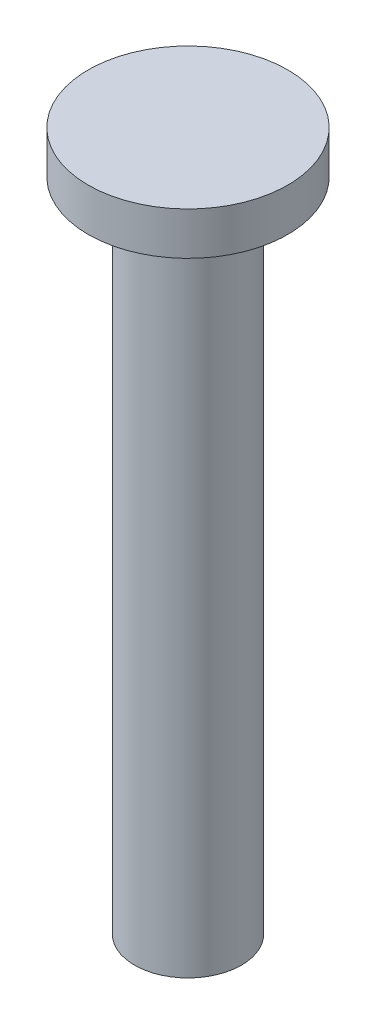
ISO-10303-21;
HEADER;
FILE_DESCRIPTION(('STEP AP214'),'2;1');
FILE_NAME('part.step','',(''),(''),'','','');
FILE_SCHEMA(('AUTOMOTIVE_DESIGN { 1 0 10303 214 1 1 1 1 }'));
ENDSEC;
DATA;
#1=APPLICATION_CONTEXT('core data for automotive mechanical design processes');
#2=APPLICATION_PROTOCOL_DEFINITION('international standard','automotive_design',2000,#1);
#3=PRODUCT_CONTEXT('',#1,'mechanical');
#4=PRODUCT('Part','Part','',(#3));
#5=PRODUCT_RELATED_PRODUCT_CATEGORY('part','',(#4));
#6=PRODUCT_DEFINITION_FORMATION('','',#4);
#7=PRODUCT_DEFINITION_CONTEXT('part definition',#1,'design');
#8=PRODUCT_DEFINITION('design','',#6,#7);
#9=PRODUCT_DEFINITION_SHAPE('','',#8);
#10=(LENGTH_UNIT() NAMED_UNIT(*) SI_UNIT(.MILLI.,.METRE.));
#11=(NAMED_UNIT(*) PLANE_ANGLE_UNIT() SI_UNIT($,.RADIAN.));
#12=(NAMED_UNIT(*) SI_UNIT($,.STERADIAN.) SOLID_ANGLE_UNIT());
#13=UNCERTAINTY_MEASURE_WITH_UNIT(LENGTH_MEASURE(1.E-05),#10,'distance_accuracy_value','');
#14=(GEOMETRIC_REPRESENTATION_CONTEXT(3) GLOBAL_UNCERTAINTY_ASSIGNED_CONTEXT((#13)) GLOBAL_UNIT_ASSIGNED_CONTEXT((#10,
#11,#12)) REPRESENTATION_CONTEXT('',''));
#15=CARTESIAN_POINT('',(0.,0.,0.));
#16=DIRECTION('',(0.,0.,1.));
#17=DIRECTION('',(1.,0.,0.));
#18=AXIS2_PLACEMENT_3D('',#15,#16,#17);
#19=CARTESIAN_POINT('',(1.875,0.,0.));
#20=DIRECTION('',(0.,-1.,0.));
#21=DIRECTION('',(0.,0.,-1.));
#22=AXIS2_PLACEMENT_3D('',#19,#20,#21);
#23=PLANE('',#22);
#24=CARTESIAN_POINT('',(0.,0.,0.));
#25=DIRECTION('',(0.,-1.,0.));
#26=DIRECTION('',(0.,0.,-1.));
#27=AXIS2_PLACEMENT_3D('',#24,#25,#26);
#28=CIRCLE('',#27,1.875);
#29=CARTESIAN_POINT('',(0.,0.,-1.875));
#30=VERTEX_POINT('',#29);
#31=EDGE_CURVE('E47',#30,#30,#28,.T.);
#32=ORIENTED_EDGE('',*,*,#31,.T.);
#33=EDGE_LOOP('',(#32));
#34=FACE_BOUND('',#33,.T.);
#35=ADVANCED_FACE('F33',(#34),#23,.T.);
#36=CARTESIAN_POINT('',(0.,24.5,0.));
#37=DIRECTION('',(0.,1.,0.));
#38=DIRECTION('',(0.,0.,1.));
#39=AXIS2_PLACEMENT_3D('',#36,#37,#38);
#40=PLANE('',#39);
#41=CARTESIAN_POINT('',(0.,24.5,0.));
#42=DIRECTION('',(0.,-1.,0.));
#43=DIRECTION('',(0.,0.,-1.));
#44=AXIS2_PLACEMENT_3D('',#41,#42,#43);
#45=CIRCLE('',#44,3.5);
#46=CARTESIAN_POINT('',(0.,24.5,-3.5));
#47=VERTEX_POINT('',#46);
#48=EDGE_CURVE('E10',#47,#47,#45,.T.);
#49=ORIENTED_EDGE('',*,*,#48,.F.);
#50=EDGE_LOOP('',(#49));
#51=FACE_BOUND('',#50,.T.);
#52=ADVANCED_FACE('F65',(#51),#40,.T.);
#53=CARTESIAN_POINT('',(0.,0.,0.));
#54=DIRECTION('',(0.,-1.,0.));
#55=DIRECTION('',(0.,0.,-1.));
#56=AXIS2_PLACEMENT_3D('',#53,#54,#55);
#57=CYLINDRICAL_SURFACE('',#56,3.5);
#58=ORIENTED_EDGE('',*,*,#48,.T.);
#59=EDGE_LOOP('',(#58));
#60=FACE_BOUND('',#59,.T.);
#61=CARTESIAN_POINT('',(0.,23.,0.));
#62=DIRECTION('',(0.,-1.,0.));
#63=DIRECTION('',(0.,0.,-1.));
#64=AXIS2_PLACEMENT_3D('',#61,#62,#63);
#65=CIRCLE('',#64,3.5);
#66=CARTESIAN_POINT('',(0.,23.,-3.5));
#67=VERTEX_POINT('',#66);
#68=EDGE_CURVE('E39',#67,#67,#65,.T.);
#69=ORIENTED_EDGE('',*,*,#68,.F.);
#70=EDGE_LOOP('',(#69));
#71=FACE_BOUND('',#70,.T.);
#72=ADVANCED_FACE('F62',(#60,#71),#57,.T.);
#73=CARTESIAN_POINT('',(3.5,23.,0.));
#74=DIRECTION('',(0.,-1.,0.));
#75=DIRECTION('',(0.,0.,-1.));
#76=AXIS2_PLACEMENT_3D('',#73,#74,#75);
#77=PLANE('',#76);
#78=ORIENTED_EDGE('',*,*,#68,.T.);
#79=EDGE_LOOP('',(#78));
#80=FACE_BOUND('',#79,.T.);
#81=CARTESIAN_POINT('',(0.,23.,0.));
#82=DIRECTION('',(0.,-1.,0.));
#83=DIRECTION('',(0.,0.,-1.));
#84=AXIS2_PLACEMENT_3D('',#81,#82,#83);
#85=CIRCLE('',#84,1.875);
#86=CARTESIAN_POINT('',(0.,23.,-1.875));
#87=VERTEX_POINT('',#86);
#88=EDGE_CURVE('E43',#87,#87,#85,.T.);
#89=ORIENTED_EDGE('',*,*,#88,.F.);
#90=EDGE_LOOP('',(#89));
#91=FACE_BOUND('',#90,.T.);
#92=ADVANCED_FACE('F56',(#80,#91),#77,.T.);
#93=CARTESIAN_POINT('',(0.,0.,0.));
#94=DIRECTION('',(0.,-1.,0.));
#95=DIRECTION('',(0.,0.,-1.));
#96=AXIS2_PLACEMENT_3D('',#93,#94,#95);
#97=CYLINDRICAL_SURFACE('',#96,1.875);
#98=ORIENTED_EDGE('',*,*,#88,.T.);
#99=EDGE_LOOP('',(#98));
#100=FACE_BOUND('',#99,.T.);
#101=ORIENTED_EDGE('',*,*,#31,.F.);
#102=EDGE_LOOP('',(#101));
#103=FACE_BOUND('',#102,.T.);
#104=ADVANCED_FACE('F54',(#100,#103),#97,.T.);
#105=CLOSED_SHELL('',(#35,#52,#72,#92,#104));
#106=MANIFOLD_SOLID_BREP('B2',#105);
#107=ADVANCED_BREP_SHAPE_REPRESENTATION('',(#18,#106),#14);
#108=SHAPE_DEFINITION_REPRESENTATION(#9,#107);
ENDSEC;
END-ISO-10303-21;
